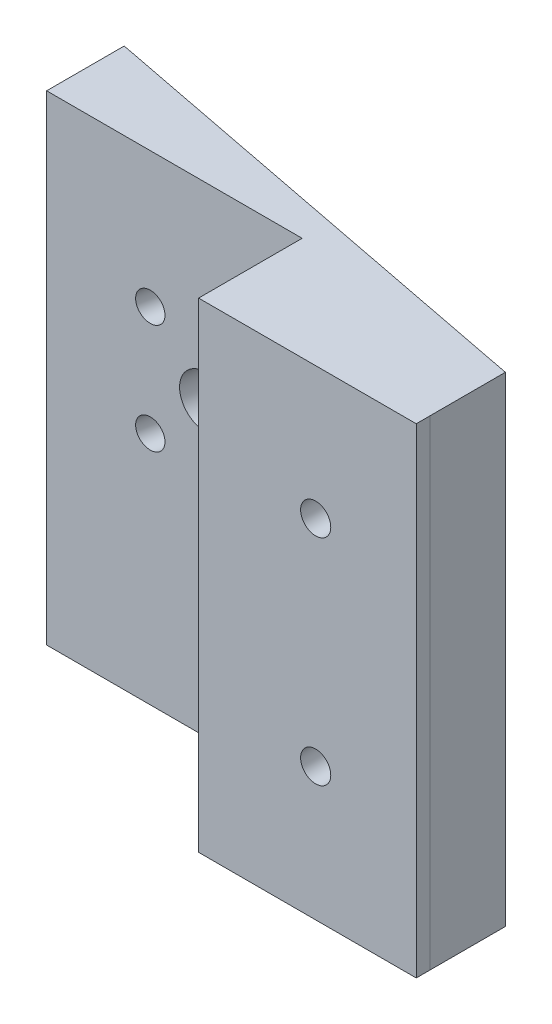
ISO-10303-21;
HEADER;
FILE_DESCRIPTION(('STEP AP214'),'2;1');
FILE_NAME('part.step','',(''),(''),'','','');
FILE_SCHEMA(('AUTOMOTIVE_DESIGN { 1 0 10303 214 1 1 1 1 }'));
ENDSEC;
DATA;
#1=APPLICATION_CONTEXT('core data for automotive mechanical design processes');
#2=APPLICATION_PROTOCOL_DEFINITION('international standard','automotive_design',2000,#1);
#3=PRODUCT_CONTEXT('',#1,'mechanical');
#4=PRODUCT('Part','Part','',(#3));
#5=PRODUCT_RELATED_PRODUCT_CATEGORY('part','',(#4));
#6=PRODUCT_DEFINITION_FORMATION('','',#4);
#7=PRODUCT_DEFINITION_CONTEXT('part definition',#1,'design');
#8=PRODUCT_DEFINITION('design','',#6,#7);
#9=PRODUCT_DEFINITION_SHAPE('','',#8);
#10=(LENGTH_UNIT() NAMED_UNIT(*) SI_UNIT(.MILLI.,.METRE.));
#11=(NAMED_UNIT(*) PLANE_ANGLE_UNIT() SI_UNIT($,.RADIAN.));
#12=(NAMED_UNIT(*) SI_UNIT($,.STERADIAN.) SOLID_ANGLE_UNIT());
#13=UNCERTAINTY_MEASURE_WITH_UNIT(LENGTH_MEASURE(1.E-05),#10,'distance_accuracy_value','');
#14=(GEOMETRIC_REPRESENTATION_CONTEXT(3) GLOBAL_UNCERTAINTY_ASSIGNED_CONTEXT((#13)) GLOBAL_UNIT_ASSIGNED_CONTEXT((#10,
#11,#12)) REPRESENTATION_CONTEXT('',''));
#15=CARTESIAN_POINT('',(0.,0.,0.));
#16=DIRECTION('',(0.,0.,1.));
#17=DIRECTION('',(1.,0.,0.));
#18=AXIS2_PLACEMENT_3D('',#15,#16,#17);
#19=CARTESIAN_POINT('',(3.44867350098541,-74.,-17.7418871092655));
#20=DIRECTION('',(-0.190808995376538,0.,0.981627183447665));
#21=DIRECTION('',(0.981627183447665,0.,0.190808995376538));
#22=AXIS2_PLACEMENT_3D('',#19,#20,#21);
#23=PLANE('',#22);
#24=CARTESIAN_POINT('',(54.3368727091996,-21.3006489695735,-7.8502232157114));
#25=DIRECTION('',(-0.190808995376538,0.,0.981627183447665));
#26=DIRECTION('',(0.981627183447665,0.,0.190808995376538));
#27=AXIS2_PLACEMENT_3D('',#24,#25,#26);
#28=ELLIPSE('',#27,2.24117672890147,2.2);
#29=CARTESIAN_POINT('',(56.5368727091996,-21.3006489695735,-7.42258653560844));
#30=VERTEX_POINT('',#29);
#31=EDGE_CURVE('E246',#30,#30,#28,.T.);
#32=ORIENTED_EDGE('',*,*,#31,.T.);
#33=EDGE_LOOP('',(#32));
#34=FACE_BOUND('',#33,.T.);
#35=CARTESIAN_POINT('',(54.3368727091997,-52.6137332726579,-7.85022321571137));
#36=DIRECTION('',(-0.190808995376538,0.,0.981627183447665));
#37=DIRECTION('',(0.981627183447665,0.,0.190808995376538));
#38=AXIS2_PLACEMENT_3D('',#35,#36,#37);
#39=ELLIPSE('',#38,2.24117672890147,2.2);
#40=CARTESIAN_POINT('',(56.5368727091997,-52.6137332726579,-7.42258653560841));
#41=VERTEX_POINT('',#40);
#42=EDGE_CURVE('E250',#41,#41,#39,.T.);
#43=ORIENTED_EDGE('',*,*,#42,.T.);
#44=EDGE_LOOP('',(#43));
#45=FACE_BOUND('',#44,.T.);
#46=CARTESIAN_POINT('',(16.6876621186104,-37.72195575,-15.1684884091009));
#47=DIRECTION('',(-0.190808995376538,0.,0.981627183447665));
#48=DIRECTION('',(-0.981627183447665,0.,-0.190808995376538));
#49=AXIS2_PLACEMENT_3D('',#46,#47,#48);
#50=CIRCLE('',#49,2.1);
#51=CARTESIAN_POINT('',(14.6262450333704,-37.72195575,-15.5691872993917));
#52=VERTEX_POINT('',#51);
#53=EDGE_CURVE('E254',#52,#52,#50,.T.);
#54=ORIENTED_EDGE('',*,*,#53,.T.);
#55=EDGE_LOOP('',(#54));
#56=FACE_BOUND('',#55,.T.);
#57=CARTESIAN_POINT('',(16.6876621186104,-21.72195575,-15.1684884091009));
#58=DIRECTION('',(-0.190808995376538,0.,0.981627183447665));
#59=DIRECTION('',(-0.981627183447665,0.,-0.190808995376538));
#60=AXIS2_PLACEMENT_3D('',#57,#58,#59);
#61=CIRCLE('',#60,2.1);
#62=CARTESIAN_POINT('',(14.6262450333703,-21.72195575,-15.5691872993917));
#63=VERTEX_POINT('',#62);
#64=EDGE_CURVE('E258',#63,#63,#61,.T.);
#65=ORIENTED_EDGE('',*,*,#64,.T.);
#66=EDGE_LOOP('',(#65));
#67=FACE_BOUND('',#66,.T.);
#68=CARTESIAN_POINT('',(32.3936970537731,-21.72195575,-12.1155444830763));
#69=DIRECTION('',(-0.190808995376538,0.,0.981627183447665));
#70=DIRECTION('',(-0.981627183447665,0.,-0.190808995376538));
#71=AXIS2_PLACEMENT_3D('',#68,#69,#70);
#72=CIRCLE('',#71,2.1);
#73=CARTESIAN_POINT('',(30.332279968533,-21.72195575,-12.516243373367));
#74=VERTEX_POINT('',#73);
#75=EDGE_CURVE('E262',#74,#74,#72,.T.);
#76=ORIENTED_EDGE('',*,*,#75,.T.);
#77=EDGE_LOOP('',(#76));
#78=FACE_BOUND('',#77,.T.);
#79=CARTESIAN_POINT('',(32.3936970537731,-37.72195575,-12.1155444830763));
#80=DIRECTION('',(-0.190808995376538,0.,0.981627183447665));
#81=DIRECTION('',(-0.981627183447665,0.,-0.190808995376538));
#82=AXIS2_PLACEMENT_3D('',#79,#80,#81);
#83=CIRCLE('',#82,2.1);
#84=CARTESIAN_POINT('',(30.332279968533,-37.72195575,-12.516243373367));
#85=VERTEX_POINT('',#84);
#86=EDGE_CURVE('E197',#85,#85,#83,.T.);
#87=ORIENTED_EDGE('',*,*,#86,.T.);
#88=EDGE_LOOP('',(#87));
#89=FACE_BOUND('',#88,.T.);
#90=CARTESIAN_POINT('',(24.5406795861918,-29.72195575,-13.6420164460886));
#91=DIRECTION('',(-0.190808995376538,0.,0.981627183447665));
#92=DIRECTION('',(-0.981627183447665,0.,-0.190808995376538));
#93=AXIS2_PLACEMENT_3D('',#90,#91,#92);
#94=CIRCLE('',#93,3.81000000000006);
#95=CARTESIAN_POINT('',(20.8006800172561,-29.72195575,-14.3689987184732));
#96=VERTEX_POINT('',#95);
#97=EDGE_CURVE('E192',#96,#96,#94,.T.);
#98=ORIENTED_EDGE('',*,*,#97,.T.);
#99=EDGE_LOOP('',(#98));
#100=FACE_BOUND('',#99,.T.);
#101=DIRECTION('',(-0.981627183447665,0.,-0.190808995376538));
#102=VECTOR('',#101,1.);
#103=CARTESIAN_POINT('',(3.44867350098541,-72.,-17.7418871092655));
#104=LINE('',#103,#102);
#105=CARTESIAN_POINT('',(69.,-72.,-5.));
#106=VERTEX_POINT('',#105);
#107=CARTESIAN_POINT('',(0.,-72.,-18.4122413305021));
#108=VERTEX_POINT('',#107);
#109=EDGE_CURVE('E226',#106,#108,#104,.T.);
#110=ORIENTED_EDGE('',*,*,#109,.T.);
#111=DIRECTION('',(0.,1.,0.));
#112=VECTOR('',#111,1.);
#113=CARTESIAN_POINT('',(0.,-74.,-18.4122413305021));
#114=LINE('',#113,#112);
#115=CARTESIAN_POINT('',(0.,-2.,-18.4122413305021));
#116=VERTEX_POINT('',#115);
#117=EDGE_CURVE('E11',#108,#116,#114,.T.);
#118=ORIENTED_EDGE('',*,*,#117,.T.);
#119=DIRECTION('',(0.981627183447665,0.,0.190808995376538));
#120=VECTOR('',#119,1.);
#121=CARTESIAN_POINT('',(69.,-2.,-5.));
#122=LINE('',#121,#120);
#123=CARTESIAN_POINT('',(69.,-2.,-5.));
#124=VERTEX_POINT('',#123);
#125=EDGE_CURVE('E179',#116,#124,#122,.T.);
#126=ORIENTED_EDGE('',*,*,#125,.T.);
#127=DIRECTION('',(0.,1.,0.));
#128=VECTOR('',#127,1.);
#129=CARTESIAN_POINT('',(69.,-74.,-5.));
#130=LINE('',#129,#128);
#131=EDGE_CURVE('E43',#106,#124,#130,.T.);
#132=ORIENTED_EDGE('',*,*,#131,.F.);
#133=EDGE_LOOP('',(#110,#118,#126,#132));
#134=FACE_BOUND('',#133,.T.);
#135=ADVANCED_FACE('F35',(#34,#45,#56,#67,#78,#89,#100,#134),#23,.F.);
#136=CARTESIAN_POINT('',(0.,-74.,0.));
#137=DIRECTION('',(1.,0.,0.));
#138=DIRECTION('',(0.,0.,-1.));
#139=AXIS2_PLACEMENT_3D('',#136,#137,#138);
#140=PLANE('',#139);
#141=DIRECTION('',(0.,0.,1.));
#142=VECTOR('',#141,1.);
#143=CARTESIAN_POINT('',(0.,-72.,0.));
#144=LINE('',#143,#142);
#145=CARTESIAN_POINT('',(0.,-72.,-7.1));
#146=VERTEX_POINT('',#145);
#147=EDGE_CURVE('E185',#108,#146,#144,.T.);
#148=ORIENTED_EDGE('',*,*,#147,.T.);
#149=DIRECTION('',(0.,-1.,0.));
#150=VECTOR('',#149,1.);
#151=CARTESIAN_POINT('',(0.,-1.99999999999998,-7.1));
#152=LINE('',#151,#150);
#153=CARTESIAN_POINT('',(0.,-1.99999999999998,-7.1));
#154=VERTEX_POINT('',#153);
#155=EDGE_CURVE('E218',#154,#146,#152,.T.);
#156=ORIENTED_EDGE('',*,*,#155,.F.);
#157=DIRECTION('',(0.,0.,-1.));
#158=VECTOR('',#157,1.);
#159=CARTESIAN_POINT('',(0.,-2.,-18.4122413305021));
#160=LINE('',#159,#158);
#161=EDGE_CURVE('E59',#154,#116,#160,.T.);
#162=ORIENTED_EDGE('',*,*,#161,.T.);
#163=ORIENTED_EDGE('',*,*,#117,.F.);
#164=EDGE_LOOP('',(#148,#156,#162,#163));
#165=FACE_BOUND('',#164,.T.);
#166=ADVANCED_FACE('F166',(#165),#140,.F.);
#167=CARTESIAN_POINT('',(69.,-74.,0.));
#168=DIRECTION('',(1.,0.,0.));
#169=DIRECTION('',(0.,0.,-1.));
#170=AXIS2_PLACEMENT_3D('',#167,#168,#169);
#171=PLANE('',#170);
#172=ORIENTED_EDGE('',*,*,#131,.T.);
#173=DIRECTION('',(0.,0.,1.));
#174=VECTOR('',#173,1.);
#175=CARTESIAN_POINT('',(69.,-2.,6.));
#176=LINE('',#175,#174);
#177=CARTESIAN_POINT('',(69.0029404501429,-1.99999999999999,6.));
#178=VERTEX_POINT('',#177);
#179=EDGE_CURVE('E116',#124,#178,#176,.T.);
#180=ORIENTED_EDGE('',*,*,#179,.T.);
#181=CARTESIAN_POINT('',(69.,-2.,6.));
#182=DIRECTION('',(0.,-1.,0.));
#183=VECTOR('',#182,1.);
#184=LINE('',#181,#183);
#185=CARTESIAN_POINT('',(69.0029404501429,-72.,6.));
#186=VERTEX_POINT('',#185);
#187=EDGE_CURVE('E130',#178,#186,#184,.T.);
#188=ORIENTED_EDGE('',*,*,#187,.T.);
#189=DIRECTION('',(0.,0.,1.));
#190=VECTOR('',#189,1.);
#191=CARTESIAN_POINT('',(69.,-72.,0.));
#192=LINE('',#191,#190);
#193=EDGE_CURVE('E182',#106,#186,#192,.T.);
#194=ORIENTED_EDGE('',*,*,#193,.F.);
#195=EDGE_LOOP('',(#172,#180,#188,#194));
#196=FACE_BOUND('',#195,.T.);
#197=ADVANCED_FACE('F163',(#196),#171,.T.);
#198=CARTESIAN_POINT('',(37.2613586201258,-4.,-9.1));
#199=DIRECTION('',(1.,0.,0.));
#200=DIRECTION('',(0.,0.,-1.));
#201=AXIS2_PLACEMENT_3D('',#198,#199,#200);
#202=PLANE('',#201);
#203=DIRECTION('',(0.,0.,1.));
#204=VECTOR('',#203,1.);
#205=CARTESIAN_POINT('',(37.2613586201258,-72.,-9.1));
#206=LINE('',#205,#204);
#207=CARTESIAN_POINT('',(37.2613586201258,-72.,-7.1));
#208=VERTEX_POINT('',#207);
#209=CARTESIAN_POINT('',(37.2613586201258,-72.,8.));
#210=VERTEX_POINT('',#209);
#211=EDGE_CURVE('E120',#208,#210,#206,.T.);
#212=ORIENTED_EDGE('',*,*,#211,.T.);
#213=DIRECTION('',(0.,-1.,0.));
#214=VECTOR('',#213,1.);
#215=CARTESIAN_POINT('',(37.2613586201258,-1.99999999999998,8.));
#216=LINE('',#215,#214);
#217=CARTESIAN_POINT('',(37.2613586201258,-1.99999999999998,8.));
#218=VERTEX_POINT('',#217);
#219=EDGE_CURVE('E103',#218,#210,#216,.T.);
#220=ORIENTED_EDGE('',*,*,#219,.F.);
#221=DIRECTION('',(0.,0.,-1.));
#222=VECTOR('',#221,1.);
#223=CARTESIAN_POINT('',(37.2613586201258,-2.,-9.1));
#224=LINE('',#223,#222);
#225=CARTESIAN_POINT('',(37.2613586201258,-1.99999999999998,-7.1));
#226=VERTEX_POINT('',#225);
#227=EDGE_CURVE('E112',#218,#226,#224,.T.);
#228=ORIENTED_EDGE('',*,*,#227,.T.);
#229=DIRECTION('',(0.,-1.,0.));
#230=VECTOR('',#229,1.);
#231=CARTESIAN_POINT('',(37.2613586201258,-1.99999999999998,-7.1));
#232=LINE('',#231,#230);
#233=EDGE_CURVE('E220',#226,#208,#232,.T.);
#234=ORIENTED_EDGE('',*,*,#233,.T.);
#235=EDGE_LOOP('',(#212,#220,#228,#234));
#236=FACE_BOUND('',#235,.T.);
#237=ADVANCED_FACE('F118',(#236),#202,.F.);
#238=CARTESIAN_POINT('',(0.,-2.,0.));
#239=DIRECTION('',(0.,-1.,0.));
#240=DIRECTION('',(0.,0.,1.));
#241=AXIS2_PLACEMENT_3D('',#238,#239,#240);
#242=PLANE('',#241);
#243=DIRECTION('',(1.,0.,0.));
#244=VECTOR('',#243,1.);
#245=CARTESIAN_POINT('',(0.,-1.99999999999998,-7.1));
#246=LINE('',#245,#244);
#247=EDGE_CURVE('E114',#154,#226,#246,.T.);
#248=ORIENTED_EDGE('',*,*,#247,.T.);
#249=ORIENTED_EDGE('',*,*,#227,.F.);
#250=DIRECTION('',(1.,0.,0.));
#251=VECTOR('',#250,1.);
#252=CARTESIAN_POINT('',(37.2613586201258,-1.99999999999998,8.));
#253=LINE('',#252,#251);
#254=CARTESIAN_POINT('',(69.0058809002858,-1.99999999999998,8.));
#255=VERTEX_POINT('',#254);
#256=EDGE_CURVE('E98',#218,#255,#253,.T.);
#257=ORIENTED_EDGE('',*,*,#256,.T.);
#258=DIRECTION('',(0.,0.,-1.));
#259=VECTOR('',#258,1.);
#260=CARTESIAN_POINT('',(69.0058809002858,-1.99999999999998,6.));
#261=LINE('',#260,#259);
#262=EDGE_CURVE('E108',#255,#178,#261,.T.);
#263=ORIENTED_EDGE('',*,*,#262,.T.);
#264=ORIENTED_EDGE('',*,*,#179,.F.);
#265=ORIENTED_EDGE('',*,*,#125,.F.);
#266=ORIENTED_EDGE('',*,*,#161,.F.);
#267=EDGE_LOOP('',(#248,#249,#257,#263,#264,#265,#266));
#268=FACE_BOUND('',#267,.T.);
#269=ADVANCED_FACE('F113',(#268),#242,.F.);
#270=CARTESIAN_POINT('',(28.7980207423715,-72.,-8.89852110577039));
#271=DIRECTION('',(0.,-1.,0.));
#272=DIRECTION('',(0.,0.,1.));
#273=AXIS2_PLACEMENT_3D('',#270,#271,#272);
#274=PLANE('',#273);
#275=ORIENTED_EDGE('',*,*,#109,.F.);
#276=ORIENTED_EDGE('',*,*,#193,.T.);
#277=DIRECTION('',(0.,0.,-1.));
#278=VECTOR('',#277,1.);
#279=CARTESIAN_POINT('',(69.0058809002858,-72.,6.));
#280=LINE('',#279,#278);
#281=CARTESIAN_POINT('',(69.0058809002858,-72.,8.));
#282=VERTEX_POINT('',#281);
#283=EDGE_CURVE('E109',#282,#186,#280,.T.);
#284=ORIENTED_EDGE('',*,*,#283,.F.);
#285=DIRECTION('',(1.,0.,0.));
#286=VECTOR('',#285,1.);
#287=CARTESIAN_POINT('',(37.2613586201258,-72.,8.));
#288=LINE('',#287,#286);
#289=EDGE_CURVE('E191',#210,#282,#288,.T.);
#290=ORIENTED_EDGE('',*,*,#289,.F.);
#291=ORIENTED_EDGE('',*,*,#211,.F.);
#292=DIRECTION('',(1.,0.,0.));
#293=VECTOR('',#292,1.);
#294=CARTESIAN_POINT('',(0.,-72.,-7.1));
#295=LINE('',#294,#293);
#296=EDGE_CURVE('E51',#146,#208,#295,.T.);
#297=ORIENTED_EDGE('',*,*,#296,.F.);
#298=ORIENTED_EDGE('',*,*,#147,.F.);
#299=EDGE_LOOP('',(#275,#276,#284,#290,#291,#297,#298));
#300=FACE_BOUND('',#299,.T.);
#301=ADVANCED_FACE('F154',(#300),#274,.T.);
#302=CARTESIAN_POINT('',(0.,-1.99999999999998,-7.1));
#303=DIRECTION('',(0.,0.,1.));
#304=DIRECTION('',(1.,0.,0.));
#305=AXIS2_PLACEMENT_3D('',#302,#303,#304);
#306=PLANE('',#305);
#307=CARTESIAN_POINT('',(15.1193068473754,-37.72195575,-7.1));
#308=DIRECTION('',(0.,0.,-1.));
#309=DIRECTION('',(1.,0.,0.));
#310=AXIS2_PLACEMENT_3D('',#307,#308,#309);
#311=ELLIPSE('',#310,2.13930505940594,2.1);
#312=CARTESIAN_POINT('',(17.2586119067813,-37.72195575,-7.1));
#313=VERTEX_POINT('',#312);
#314=EDGE_CURVE('E38',#313,#313,#311,.T.);
#315=ORIENTED_EDGE('',*,*,#314,.T.);
#316=EDGE_LOOP('',(#315));
#317=FACE_BOUND('',#316,.T.);
#318=CARTESIAN_POINT('',(15.1193068473754,-21.72195575,-7.1));
#319=DIRECTION('',(0.,0.,-1.));
#320=DIRECTION('',(1.,0.,0.));
#321=AXIS2_PLACEMENT_3D('',#318,#319,#320);
#322=ELLIPSE('',#321,2.13930505940595,2.1);
#323=CARTESIAN_POINT('',(17.2586119067813,-21.72195575,-7.1));
#324=VERTEX_POINT('',#323);
#325=EDGE_CURVE('E199',#324,#324,#322,.T.);
#326=ORIENTED_EDGE('',*,*,#325,.T.);
#327=EDGE_LOOP('',(#326));
#328=FACE_BOUND('',#327,.T.);
#329=CARTESIAN_POINT('',(31.4187739666588,-21.72195575,-7.1));
#330=DIRECTION('',(0.,0.,-1.));
#331=DIRECTION('',(1.,0.,0.));
#332=AXIS2_PLACEMENT_3D('',#329,#330,#331);
#333=ELLIPSE('',#332,2.13930505940595,2.1);
#334=CARTESIAN_POINT('',(33.5580790260647,-21.72195575,-7.1));
#335=VERTEX_POINT('',#334);
#336=EDGE_CURVE('E196',#335,#335,#333,.T.);
#337=ORIENTED_EDGE('',*,*,#336,.T.);
#338=EDGE_LOOP('',(#337));
#339=FACE_BOUND('',#338,.T.);
#340=CARTESIAN_POINT('',(31.4187739666588,-37.72195575,-7.1));
#341=DIRECTION('',(0.,0.,-1.));
#342=DIRECTION('',(1.,0.,0.));
#343=AXIS2_PLACEMENT_3D('',#340,#341,#342);
#344=ELLIPSE('',#343,2.13930505940594,2.1);
#345=CARTESIAN_POINT('',(33.5580790260647,-37.72195575,-7.1));
#346=VERTEX_POINT('',#345);
#347=EDGE_CURVE('E193',#346,#346,#344,.T.);
#348=ORIENTED_EDGE('',*,*,#347,.T.);
#349=EDGE_LOOP('',(#348));
#350=FACE_BOUND('',#349,.T.);
#351=CARTESIAN_POINT('',(23.2690404070171,-29.72195575,-7.1));
#352=DIRECTION('',(0.,0.,-1.));
#353=DIRECTION('',(1.,0.,0.));
#354=AXIS2_PLACEMENT_3D('',#351,#352,#353);
#355=ELLIPSE('',#354,3.88131060777943,3.81000000000006);
#356=CARTESIAN_POINT('',(27.1503510147965,-29.72195575,-7.1));
#357=VERTEX_POINT('',#356);
#358=EDGE_CURVE('E188',#357,#357,#355,.T.);
#359=ORIENTED_EDGE('',*,*,#358,.T.);
#360=EDGE_LOOP('',(#359));
#361=FACE_BOUND('',#360,.T.);
#362=ORIENTED_EDGE('',*,*,#296,.T.);
#363=ORIENTED_EDGE('',*,*,#233,.F.);
#364=ORIENTED_EDGE('',*,*,#247,.F.);
#365=ORIENTED_EDGE('',*,*,#155,.T.);
#366=EDGE_LOOP('',(#362,#363,#364,#365));
#367=FACE_BOUND('',#366,.T.);
#368=ADVANCED_FACE('F146',(#317,#328,#339,#350,#361,#367),#306,.T.);
#369=CARTESIAN_POINT('',(69.0058809002858,-1.99999999999998,6.));
#370=DIRECTION('',(1.,0.,0.));
#371=DIRECTION('',(0.,0.,-1.));
#372=AXIS2_PLACEMENT_3D('',#369,#370,#371);
#373=PLANE('',#372);
#374=ORIENTED_EDGE('',*,*,#283,.T.);
#375=ORIENTED_EDGE('',*,*,#187,.F.);
#376=ORIENTED_EDGE('',*,*,#262,.F.);
#377=DIRECTION('',(0.,-1.,0.));
#378=VECTOR('',#377,1.);
#379=CARTESIAN_POINT('',(69.0058809002858,-1.99999999999998,8.));
#380=LINE('',#379,#378);
#381=EDGE_CURVE('E105',#255,#282,#380,.T.);
#382=ORIENTED_EDGE('',*,*,#381,.T.);
#383=EDGE_LOOP('',(#374,#375,#376,#382));
#384=FACE_BOUND('',#383,.T.);
#385=ADVANCED_FACE('F136',(#384),#373,.T.);
#386=CARTESIAN_POINT('',(37.2613586201258,-1.99999999999998,8.));
#387=DIRECTION('',(0.,0.,1.));
#388=DIRECTION('',(1.,0.,0.));
#389=AXIS2_PLACEMENT_3D('',#386,#387,#388);
#390=PLANE('',#389);
#391=CARTESIAN_POINT('',(54.3368727091996,-21.3006489695735,8.));
#392=DIRECTION('',(0.,0.,1.));
#393=DIRECTION('',(1.,0.,0.));
#394=AXIS2_PLACEMENT_3D('',#391,#392,#393);
#395=CIRCLE('',#394,2.2);
#396=CARTESIAN_POINT('',(56.5368727091996,-21.3006489695735,8.));
#397=VERTEX_POINT('',#396);
#398=EDGE_CURVE('E270',#397,#397,#395,.T.);
#399=ORIENTED_EDGE('',*,*,#398,.F.);
#400=EDGE_LOOP('',(#399));
#401=FACE_BOUND('',#400,.T.);
#402=CARTESIAN_POINT('',(54.3368727091997,-52.6137332726579,8.));
#403=DIRECTION('',(0.,0.,1.));
#404=DIRECTION('',(1.,0.,0.));
#405=AXIS2_PLACEMENT_3D('',#402,#403,#404);
#406=CIRCLE('',#405,2.2);
#407=CARTESIAN_POINT('',(56.5368727091997,-52.6137332726579,8.));
#408=VERTEX_POINT('',#407);
#409=EDGE_CURVE('E272',#408,#408,#406,.T.);
#410=ORIENTED_EDGE('',*,*,#409,.F.);
#411=EDGE_LOOP('',(#410));
#412=FACE_BOUND('',#411,.T.);
#413=ORIENTED_EDGE('',*,*,#289,.T.);
#414=ORIENTED_EDGE('',*,*,#381,.F.);
#415=ORIENTED_EDGE('',*,*,#256,.F.);
#416=ORIENTED_EDGE('',*,*,#219,.T.);
#417=EDGE_LOOP('',(#413,#414,#415,#416));
#418=FACE_BOUND('',#417,.T.);
#419=ADVANCED_FACE('F101',(#401,#412,#418),#390,.T.);
#420=CARTESIAN_POINT('',(19.5903394534409,-29.72195575,11.8252757642747));
#421=DIRECTION('',(0.190808995376538,0.,-0.981627183447665));
#422=DIRECTION('',(-0.981627183447665,0.,-0.190808995376538));
#423=AXIS2_PLACEMENT_3D('',#420,#421,#422);
#424=CYLINDRICAL_SURFACE('',#423,3.81000000000006);
#425=ORIENTED_EDGE('',*,*,#358,.F.);
#426=EDGE_LOOP('',(#425));
#427=FACE_BOUND('',#426,.T.);
#428=ORIENTED_EDGE('',*,*,#97,.F.);
#429=EDGE_LOOP('',(#428));
#430=FACE_BOUND('',#429,.T.);
#431=ADVANCED_FACE('F147',(#427,#430),#424,.F.);
#432=CARTESIAN_POINT('',(30.4856071000077,-37.72195575,-2.29927264859966));
#433=DIRECTION('',(0.190808995376538,0.,-0.981627183447665));
#434=DIRECTION('',(-0.981627183447665,0.,-0.190808995376538));
#435=AXIS2_PLACEMENT_3D('',#432,#433,#434);
#436=CYLINDRICAL_SURFACE('',#435,2.1);
#437=ORIENTED_EDGE('',*,*,#347,.F.);
#438=EDGE_LOOP('',(#437));
#439=FACE_BOUND('',#438,.T.);
#440=ORIENTED_EDGE('',*,*,#86,.F.);
#441=EDGE_LOOP('',(#440));
#442=FACE_BOUND('',#441,.T.);
#443=ADVANCED_FACE('F298',(#439,#442),#436,.F.);
#444=CARTESIAN_POINT('',(30.4856071000077,-21.72195575,-2.29927264859966));
#445=DIRECTION('',(0.190808995376538,0.,-0.981627183447665));
#446=DIRECTION('',(-0.981627183447665,0.,-0.190808995376538));
#447=AXIS2_PLACEMENT_3D('',#444,#445,#446);
#448=CYLINDRICAL_SURFACE('',#447,2.1);
#449=ORIENTED_EDGE('',*,*,#336,.F.);
#450=EDGE_LOOP('',(#449));
#451=FACE_BOUND('',#450,.T.);
#452=ORIENTED_EDGE('',*,*,#75,.F.);
#453=EDGE_LOOP('',(#452));
#454=FACE_BOUND('',#453,.T.);
#455=ADVANCED_FACE('F295',(#451,#454),#448,.F.);
#456=CARTESIAN_POINT('',(14.7795721648451,-21.72195575,-5.35221657462428));
#457=DIRECTION('',(0.190808995376538,0.,-0.981627183447665));
#458=DIRECTION('',(-0.981627183447665,0.,-0.190808995376538));
#459=AXIS2_PLACEMENT_3D('',#456,#457,#458);
#460=CYLINDRICAL_SURFACE('',#459,2.1);
#461=ORIENTED_EDGE('',*,*,#325,.F.);
#462=EDGE_LOOP('',(#461));
#463=FACE_BOUND('',#462,.T.);
#464=ORIENTED_EDGE('',*,*,#64,.F.);
#465=EDGE_LOOP('',(#464));
#466=FACE_BOUND('',#465,.T.);
#467=ADVANCED_FACE('F291',(#463,#466),#460,.F.);
#468=CARTESIAN_POINT('',(14.7795721648451,-37.72195575,-5.35221657462428));
#469=DIRECTION('',(0.190808995376538,0.,-0.981627183447665));
#470=DIRECTION('',(-0.981627183447665,0.,-0.190808995376538));
#471=AXIS2_PLACEMENT_3D('',#468,#469,#470);
#472=CYLINDRICAL_SURFACE('',#471,2.1);
#473=ORIENTED_EDGE('',*,*,#314,.F.);
#474=EDGE_LOOP('',(#473));
#475=FACE_BOUND('',#474,.T.);
#476=ORIENTED_EDGE('',*,*,#53,.F.);
#477=EDGE_LOOP('',(#476));
#478=FACE_BOUND('',#477,.T.);
#479=ADVANCED_FACE('F283',(#475,#478),#472,.F.);
#480=CARTESIAN_POINT('',(54.3368727091997,-52.6137332726579,-26.));
#481=DIRECTION('',(0.,0.,1.));
#482=DIRECTION('',(1.,0.,0.));
#483=AXIS2_PLACEMENT_3D('',#480,#481,#482);
#484=CYLINDRICAL_SURFACE('',#483,2.2);
#485=ORIENTED_EDGE('',*,*,#409,.T.);
#486=EDGE_LOOP('',(#485));
#487=FACE_BOUND('',#486,.T.);
#488=ORIENTED_EDGE('',*,*,#42,.F.);
#489=EDGE_LOOP('',(#488));
#490=FACE_BOUND('',#489,.T.);
#491=ADVANCED_FACE('F278',(#487,#490),#484,.F.);
#492=CARTESIAN_POINT('',(54.3368727091996,-21.3006489695735,-26.));
#493=DIRECTION('',(0.,0.,1.));
#494=DIRECTION('',(1.,0.,0.));
#495=AXIS2_PLACEMENT_3D('',#492,#493,#494);
#496=CYLINDRICAL_SURFACE('',#495,2.2);
#497=ORIENTED_EDGE('',*,*,#398,.T.);
#498=EDGE_LOOP('',(#497));
#499=FACE_BOUND('',#498,.T.);
#500=ORIENTED_EDGE('',*,*,#31,.F.);
#501=EDGE_LOOP('',(#500));
#502=FACE_BOUND('',#501,.T.);
#503=ADVANCED_FACE('F282',(#499,#502),#496,.F.);
#504=CLOSED_SHELL('',(#135,#166,#197,#237,#269,#301,#368,#385,#419,#431,#443,#455,#467,#479,
#491,#503));
#505=MANIFOLD_SOLID_BREP('B2',#504);
#506=ADVANCED_BREP_SHAPE_REPRESENTATION('',(#18,#505),#14);
#507=SHAPE_DEFINITION_REPRESENTATION(#9,#506);
ENDSEC;
END-ISO-10303-21;
